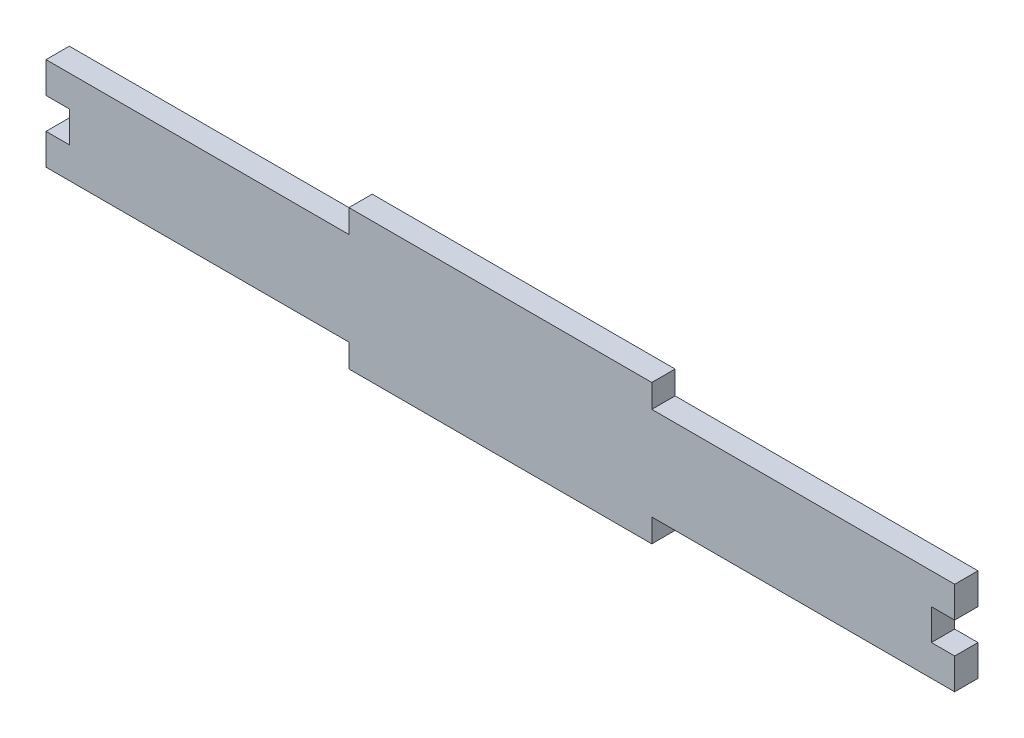
ISO-10303-21;
HEADER;
FILE_DESCRIPTION(('STEP AP214'),'2;1');
FILE_NAME('part.step','',(''),(''),'','','');
FILE_SCHEMA(('AUTOMOTIVE_DESIGN { 1 0 10303 214 1 1 1 1 }'));
ENDSEC;
DATA;
#1=APPLICATION_CONTEXT('core data for automotive mechanical design processes');
#2=APPLICATION_PROTOCOL_DEFINITION('international standard','automotive_design',2000,#1);
#3=PRODUCT_CONTEXT('',#1,'mechanical');
#4=PRODUCT('Part','Part','',(#3));
#5=PRODUCT_RELATED_PRODUCT_CATEGORY('part','',(#4));
#6=PRODUCT_DEFINITION_FORMATION('','',#4);
#7=PRODUCT_DEFINITION_CONTEXT('part definition',#1,'design');
#8=PRODUCT_DEFINITION('design','',#6,#7);
#9=PRODUCT_DEFINITION_SHAPE('','',#8);
#10=(LENGTH_UNIT() NAMED_UNIT(*) SI_UNIT(.MILLI.,.METRE.));
#11=(NAMED_UNIT(*) PLANE_ANGLE_UNIT() SI_UNIT($,.RADIAN.));
#12=(NAMED_UNIT(*) SI_UNIT($,.STERADIAN.) SOLID_ANGLE_UNIT());
#13=UNCERTAINTY_MEASURE_WITH_UNIT(LENGTH_MEASURE(1.E-05),#10,'distance_accuracy_value','');
#14=(GEOMETRIC_REPRESENTATION_CONTEXT(3) GLOBAL_UNCERTAINTY_ASSIGNED_CONTEXT((#13)) GLOBAL_UNIT_ASSIGNED_CONTEXT((#10,
#11,#12)) REPRESENTATION_CONTEXT('',''));
#15=CARTESIAN_POINT('',(0.,0.,0.));
#16=DIRECTION('',(0.,0.,1.));
#17=DIRECTION('',(1.,0.,0.));
#18=AXIS2_PLACEMENT_3D('',#15,#16,#17);
#19=CARTESIAN_POINT('',(-19.5,-8.99999999999999,3.));
#20=DIRECTION('',(1.,0.,0.));
#21=DIRECTION('',(0.,0.,-1.));
#22=AXIS2_PLACEMENT_3D('',#19,#20,#21);
#23=PLANE('',#22);
#24=DIRECTION('',(0.,-1.,0.));
#25=VECTOR('',#24,1.);
#26=CARTESIAN_POINT('',(-19.5,-8.99999999999999,0.));
#27=LINE('',#26,#25);
#28=CARTESIAN_POINT('',(-19.5,-6.00000000000001,0.));
#29=VERTEX_POINT('',#28);
#30=CARTESIAN_POINT('',(-19.5,-8.99999999999999,0.));
#31=VERTEX_POINT('',#30);
#32=EDGE_CURVE('E201',#29,#31,#27,.T.);
#33=ORIENTED_EDGE('',*,*,#32,.T.);
#34=DIRECTION('',(0.,0.,-1.));
#35=VECTOR('',#34,1.);
#36=CARTESIAN_POINT('',(-19.5,-8.99999999999999,3.));
#37=LINE('',#36,#35);
#38=CARTESIAN_POINT('',(-19.5,-8.99999999999999,3.));
#39=VERTEX_POINT('',#38);
#40=EDGE_CURVE('E11',#39,#31,#37,.T.);
#41=ORIENTED_EDGE('',*,*,#40,.F.);
#42=DIRECTION('',(0.,-1.,0.));
#43=VECTOR('',#42,1.);
#44=CARTESIAN_POINT('',(-19.5,-8.99999999999999,3.));
#45=LINE('',#44,#43);
#46=CARTESIAN_POINT('',(-19.5,-6.00000000000001,3.));
#47=VERTEX_POINT('',#46);
#48=EDGE_CURVE('E239',#47,#39,#45,.T.);
#49=ORIENTED_EDGE('',*,*,#48,.F.);
#50=DIRECTION('',(0.,0.,-1.));
#51=VECTOR('',#50,1.);
#52=CARTESIAN_POINT('',(-19.5,-6.00000000000001,3.));
#53=LINE('',#52,#51);
#54=EDGE_CURVE('E197',#47,#29,#53,.T.);
#55=ORIENTED_EDGE('',*,*,#54,.T.);
#56=EDGE_LOOP('',(#33,#41,#49,#55));
#57=FACE_BOUND('',#56,.T.);
#58=ADVANCED_FACE('F33',(#57),#23,.F.);
#59=CARTESIAN_POINT('',(-19.5,-8.99999999999999,3.));
#60=DIRECTION('',(0.,1.,0.));
#61=DIRECTION('',(-1.,0.,0.));
#62=AXIS2_PLACEMENT_3D('',#59,#60,#61);
#63=PLANE('',#62);
#64=DIRECTION('',(1.,0.,0.));
#65=VECTOR('',#64,1.);
#66=CARTESIAN_POINT('',(-19.5,-8.99999999999999,0.));
#67=LINE('',#66,#65);
#68=CARTESIAN_POINT('',(19.5,-9.,0.));
#69=VERTEX_POINT('',#68);
#70=EDGE_CURVE('E204',#31,#69,#67,.T.);
#71=ORIENTED_EDGE('',*,*,#70,.T.);
#72=DIRECTION('',(0.,0.,-1.));
#73=VECTOR('',#72,1.);
#74=CARTESIAN_POINT('',(19.5,-9.,3.));
#75=LINE('',#74,#73);
#76=CARTESIAN_POINT('',(19.5,-9.,3.));
#77=VERTEX_POINT('',#76);
#78=EDGE_CURVE('E41',#77,#69,#75,.T.);
#79=ORIENTED_EDGE('',*,*,#78,.F.);
#80=DIRECTION('',(1.,0.,0.));
#81=VECTOR('',#80,1.);
#82=CARTESIAN_POINT('',(-19.5,-8.99999999999999,3.));
#83=LINE('',#82,#81);
#84=EDGE_CURVE('E128',#39,#77,#83,.T.);
#85=ORIENTED_EDGE('',*,*,#84,.F.);
#86=ORIENTED_EDGE('',*,*,#40,.T.);
#87=EDGE_LOOP('',(#71,#79,#85,#86));
#88=FACE_BOUND('',#87,.T.);
#89=ADVANCED_FACE('F357',(#88),#63,.F.);
#90=CARTESIAN_POINT('',(19.5,-6.00000000000002,3.));
#91=DIRECTION('',(-1.,0.,0.));
#92=DIRECTION('',(0.,0.,1.));
#93=AXIS2_PLACEMENT_3D('',#90,#91,#92);
#94=PLANE('',#93);
#95=DIRECTION('',(0.,1.,0.));
#96=VECTOR('',#95,1.);
#97=CARTESIAN_POINT('',(19.5,-6.00000000000002,0.));
#98=LINE('',#97,#96);
#99=CARTESIAN_POINT('',(19.5,-6.00000000000002,0.));
#100=VERTEX_POINT('',#99);
#101=EDGE_CURVE('E206',#69,#100,#98,.T.);
#102=ORIENTED_EDGE('',*,*,#101,.T.);
#103=DIRECTION('',(0.,0.,-1.));
#104=VECTOR('',#103,1.);
#105=CARTESIAN_POINT('',(19.5,-6.00000000000002,3.));
#106=LINE('',#105,#104);
#107=CARTESIAN_POINT('',(19.5,-6.00000000000002,3.));
#108=VERTEX_POINT('',#107);
#109=EDGE_CURVE('E282',#108,#100,#106,.T.);
#110=ORIENTED_EDGE('',*,*,#109,.F.);
#111=DIRECTION('',(0.,1.,0.));
#112=VECTOR('',#111,1.);
#113=CARTESIAN_POINT('',(19.5,-6.00000000000002,3.));
#114=LINE('',#113,#112);
#115=EDGE_CURVE('E290',#77,#108,#114,.T.);
#116=ORIENTED_EDGE('',*,*,#115,.F.);
#117=ORIENTED_EDGE('',*,*,#78,.T.);
#118=EDGE_LOOP('',(#102,#110,#116,#117));
#119=FACE_BOUND('',#118,.T.);
#120=ADVANCED_FACE('F288',(#119),#94,.F.);
#121=CARTESIAN_POINT('',(58.5,-6.00000000000002,3.));
#122=DIRECTION('',(0.,1.,0.));
#123=DIRECTION('',(-1.,0.,0.));
#124=AXIS2_PLACEMENT_3D('',#121,#122,#123);
#125=PLANE('',#124);
#126=DIRECTION('',(1.,0.,0.));
#127=VECTOR('',#126,1.);
#128=CARTESIAN_POINT('',(58.5,-6.00000000000002,0.));
#129=LINE('',#128,#127);
#130=CARTESIAN_POINT('',(58.5,-6.00000000000002,0.));
#131=VERTEX_POINT('',#130);
#132=EDGE_CURVE('E208',#100,#131,#129,.T.);
#133=ORIENTED_EDGE('',*,*,#132,.T.);
#134=DIRECTION('',(0.,0.,-1.));
#135=VECTOR('',#134,1.);
#136=CARTESIAN_POINT('',(58.5,-6.00000000000002,3.));
#137=LINE('',#136,#135);
#138=CARTESIAN_POINT('',(58.5,-6.00000000000002,3.));
#139=VERTEX_POINT('',#138);
#140=EDGE_CURVE('E279',#139,#131,#137,.T.);
#141=ORIENTED_EDGE('',*,*,#140,.F.);
#142=DIRECTION('',(1.,0.,0.));
#143=VECTOR('',#142,1.);
#144=CARTESIAN_POINT('',(58.5,-6.00000000000002,3.));
#145=LINE('',#144,#143);
#146=EDGE_CURVE('E308',#108,#139,#145,.T.);
#147=ORIENTED_EDGE('',*,*,#146,.F.);
#148=ORIENTED_EDGE('',*,*,#109,.T.);
#149=EDGE_LOOP('',(#133,#141,#147,#148));
#150=FACE_BOUND('',#149,.T.);
#151=ADVANCED_FACE('F299',(#150),#125,.F.);
#152=CARTESIAN_POINT('',(58.5,-2.00000000000001,3.));
#153=DIRECTION('',(-1.,0.,0.));
#154=DIRECTION('',(0.,0.,1.));
#155=AXIS2_PLACEMENT_3D('',#152,#153,#154);
#156=PLANE('',#155);
#157=DIRECTION('',(0.,1.,0.));
#158=VECTOR('',#157,1.);
#159=CARTESIAN_POINT('',(58.5,-2.00000000000001,0.));
#160=LINE('',#159,#158);
#161=CARTESIAN_POINT('',(58.5,-2.00000000000001,0.));
#162=VERTEX_POINT('',#161);
#163=EDGE_CURVE('E210',#131,#162,#160,.T.);
#164=ORIENTED_EDGE('',*,*,#163,.T.);
#165=DIRECTION('',(0.,0.,-1.));
#166=VECTOR('',#165,1.);
#167=CARTESIAN_POINT('',(58.5,-2.00000000000001,3.));
#168=LINE('',#167,#166);
#169=CARTESIAN_POINT('',(58.5,-2.00000000000001,3.));
#170=VERTEX_POINT('',#169);
#171=EDGE_CURVE('E276',#170,#162,#168,.T.);
#172=ORIENTED_EDGE('',*,*,#171,.F.);
#173=DIRECTION('',(0.,1.,0.));
#174=VECTOR('',#173,1.);
#175=CARTESIAN_POINT('',(58.5,-2.00000000000001,3.));
#176=LINE('',#175,#174);
#177=EDGE_CURVE('E305',#139,#170,#176,.T.);
#178=ORIENTED_EDGE('',*,*,#177,.F.);
#179=ORIENTED_EDGE('',*,*,#140,.T.);
#180=EDGE_LOOP('',(#164,#172,#178,#179));
#181=FACE_BOUND('',#180,.T.);
#182=ADVANCED_FACE('F303',(#181),#156,.F.);
#183=CARTESIAN_POINT('',(58.5,-2.00000000000001,3.));
#184=DIRECTION('',(0.,-1.,0.));
#185=DIRECTION('',(0.,0.,-1.));
#186=AXIS2_PLACEMENT_3D('',#183,#184,#185);
#187=PLANE('',#186);
#188=DIRECTION('',(-1.,0.,0.));
#189=VECTOR('',#188,1.);
#190=CARTESIAN_POINT('',(58.5,-2.00000000000001,0.));
#191=LINE('',#190,#189);
#192=CARTESIAN_POINT('',(55.5,-2.00000000000001,0.));
#193=VERTEX_POINT('',#192);
#194=EDGE_CURVE('E212',#162,#193,#191,.T.);
#195=ORIENTED_EDGE('',*,*,#194,.T.);
#196=DIRECTION('',(0.,0.,-1.));
#197=VECTOR('',#196,1.);
#198=CARTESIAN_POINT('',(55.5,-2.00000000000001,3.));
#199=LINE('',#198,#197);
#200=CARTESIAN_POINT('',(55.5,-2.00000000000001,3.));
#201=VERTEX_POINT('',#200);
#202=EDGE_CURVE('E273',#201,#193,#199,.T.);
#203=ORIENTED_EDGE('',*,*,#202,.F.);
#204=DIRECTION('',(-1.,0.,0.));
#205=VECTOR('',#204,1.);
#206=CARTESIAN_POINT('',(58.5,-2.00000000000001,3.));
#207=LINE('',#206,#205);
#208=EDGE_CURVE('E307',#170,#201,#207,.T.);
#209=ORIENTED_EDGE('',*,*,#208,.F.);
#210=ORIENTED_EDGE('',*,*,#171,.T.);
#211=EDGE_LOOP('',(#195,#203,#209,#210));
#212=FACE_BOUND('',#211,.T.);
#213=ADVANCED_FACE('F370',(#212),#187,.F.);
#214=CARTESIAN_POINT('',(55.5,-2.00000000000001,3.));
#215=DIRECTION('',(-1.,0.,0.));
#216=DIRECTION('',(0.,-1.,0.));
#217=AXIS2_PLACEMENT_3D('',#214,#215,#216);
#218=PLANE('',#217);
#219=DIRECTION('',(0.,1.,0.));
#220=VECTOR('',#219,1.);
#221=CARTESIAN_POINT('',(55.5,-2.00000000000001,0.));
#222=LINE('',#221,#220);
#223=CARTESIAN_POINT('',(55.5,2.00000000000001,0.));
#224=VERTEX_POINT('',#223);
#225=EDGE_CURVE('E214',#193,#224,#222,.T.);
#226=ORIENTED_EDGE('',*,*,#225,.T.);
#227=DIRECTION('',(0.,0.,-1.));
#228=VECTOR('',#227,1.);
#229=CARTESIAN_POINT('',(55.5,2.00000000000001,3.));
#230=LINE('',#229,#228);
#231=CARTESIAN_POINT('',(55.5,2.00000000000001,3.));
#232=VERTEX_POINT('',#231);
#233=EDGE_CURVE('E270',#232,#224,#230,.T.);
#234=ORIENTED_EDGE('',*,*,#233,.F.);
#235=DIRECTION('',(0.,1.,0.));
#236=VECTOR('',#235,1.);
#237=CARTESIAN_POINT('',(55.5,-2.00000000000001,3.));
#238=LINE('',#237,#236);
#239=EDGE_CURVE('E310',#201,#232,#238,.T.);
#240=ORIENTED_EDGE('',*,*,#239,.F.);
#241=ORIENTED_EDGE('',*,*,#202,.T.);
#242=EDGE_LOOP('',(#226,#234,#240,#241));
#243=FACE_BOUND('',#242,.T.);
#244=ADVANCED_FACE('F373',(#243),#218,.F.);
#245=CARTESIAN_POINT('',(55.5,2.00000000000001,3.));
#246=DIRECTION('',(0.,1.,0.));
#247=DIRECTION('',(0.,0.,1.));
#248=AXIS2_PLACEMENT_3D('',#245,#246,#247);
#249=PLANE('',#248);
#250=DIRECTION('',(1.,0.,0.));
#251=VECTOR('',#250,1.);
#252=CARTESIAN_POINT('',(55.5,2.00000000000001,0.));
#253=LINE('',#252,#251);
#254=CARTESIAN_POINT('',(58.5,2.00000000000001,0.));
#255=VERTEX_POINT('',#254);
#256=EDGE_CURVE('E216',#224,#255,#253,.T.);
#257=ORIENTED_EDGE('',*,*,#256,.T.);
#258=DIRECTION('',(0.,0.,-1.));
#259=VECTOR('',#258,1.);
#260=CARTESIAN_POINT('',(58.5,2.00000000000001,3.));
#261=LINE('',#260,#259);
#262=CARTESIAN_POINT('',(58.5,2.00000000000001,3.));
#263=VERTEX_POINT('',#262);
#264=EDGE_CURVE('E267',#263,#255,#261,.T.);
#265=ORIENTED_EDGE('',*,*,#264,.F.);
#266=DIRECTION('',(1.,0.,0.));
#267=VECTOR('',#266,1.);
#268=CARTESIAN_POINT('',(55.5,2.00000000000001,3.));
#269=LINE('',#268,#267);
#270=EDGE_CURVE('E316',#232,#263,#269,.T.);
#271=ORIENTED_EDGE('',*,*,#270,.F.);
#272=ORIENTED_EDGE('',*,*,#233,.T.);
#273=EDGE_LOOP('',(#257,#265,#271,#272));
#274=FACE_BOUND('',#273,.T.);
#275=ADVANCED_FACE('F377',(#274),#249,.F.);
#276=CARTESIAN_POINT('',(58.5,6.00000000000002,3.));
#277=DIRECTION('',(-1.,0.,0.));
#278=DIRECTION('',(0.,-1.,0.));
#279=AXIS2_PLACEMENT_3D('',#276,#277,#278);
#280=PLANE('',#279);
#281=DIRECTION('',(0.,1.,0.));
#282=VECTOR('',#281,1.);
#283=CARTESIAN_POINT('',(58.5,6.00000000000002,0.));
#284=LINE('',#283,#282);
#285=CARTESIAN_POINT('',(58.5,6.00000000000002,0.));
#286=VERTEX_POINT('',#285);
#287=EDGE_CURVE('E218',#255,#286,#284,.T.);
#288=ORIENTED_EDGE('',*,*,#287,.T.);
#289=DIRECTION('',(0.,0.,-1.));
#290=VECTOR('',#289,1.);
#291=CARTESIAN_POINT('',(58.5,6.00000000000002,3.));
#292=LINE('',#291,#290);
#293=CARTESIAN_POINT('',(58.5,6.00000000000002,3.));
#294=VERTEX_POINT('',#293);
#295=EDGE_CURVE('E264',#294,#286,#292,.T.);
#296=ORIENTED_EDGE('',*,*,#295,.F.);
#297=DIRECTION('',(0.,1.,0.));
#298=VECTOR('',#297,1.);
#299=CARTESIAN_POINT('',(58.5,6.00000000000002,3.));
#300=LINE('',#299,#298);
#301=EDGE_CURVE('E318',#263,#294,#300,.T.);
#302=ORIENTED_EDGE('',*,*,#301,.F.);
#303=ORIENTED_EDGE('',*,*,#264,.T.);
#304=EDGE_LOOP('',(#288,#296,#302,#303));
#305=FACE_BOUND('',#304,.T.);
#306=ADVANCED_FACE('F381',(#305),#280,.F.);
#307=CARTESIAN_POINT('',(19.5,6.00000000000002,3.));
#308=DIRECTION('',(0.,-1.,0.));
#309=DIRECTION('',(0.,0.,-1.));
#310=AXIS2_PLACEMENT_3D('',#307,#308,#309);
#311=PLANE('',#310);
#312=DIRECTION('',(-1.,0.,0.));
#313=VECTOR('',#312,1.);
#314=CARTESIAN_POINT('',(19.5,6.00000000000002,0.));
#315=LINE('',#314,#313);
#316=CARTESIAN_POINT('',(19.5,6.00000000000002,0.));
#317=VERTEX_POINT('',#316);
#318=EDGE_CURVE('E220',#286,#317,#315,.T.);
#319=ORIENTED_EDGE('',*,*,#318,.T.);
#320=DIRECTION('',(0.,0.,-1.));
#321=VECTOR('',#320,1.);
#322=CARTESIAN_POINT('',(19.5,6.00000000000002,3.));
#323=LINE('',#322,#321);
#324=CARTESIAN_POINT('',(19.5,6.00000000000002,3.));
#325=VERTEX_POINT('',#324);
#326=EDGE_CURVE('E261',#325,#317,#323,.T.);
#327=ORIENTED_EDGE('',*,*,#326,.F.);
#328=DIRECTION('',(-1.,0.,0.));
#329=VECTOR('',#328,1.);
#330=CARTESIAN_POINT('',(19.5,6.00000000000002,3.));
#331=LINE('',#330,#329);
#332=EDGE_CURVE('E320',#294,#325,#331,.T.);
#333=ORIENTED_EDGE('',*,*,#332,.F.);
#334=ORIENTED_EDGE('',*,*,#295,.T.);
#335=EDGE_LOOP('',(#319,#327,#333,#334));
#336=FACE_BOUND('',#335,.T.);
#337=ADVANCED_FACE('F385',(#336),#311,.F.);
#338=CARTESIAN_POINT('',(19.5,8.99999999999999,3.));
#339=DIRECTION('',(-1.,0.,0.));
#340=DIRECTION('',(0.,0.,1.));
#341=AXIS2_PLACEMENT_3D('',#338,#339,#340);
#342=PLANE('',#341);
#343=DIRECTION('',(0.,1.,0.));
#344=VECTOR('',#343,1.);
#345=CARTESIAN_POINT('',(19.5,8.99999999999999,0.));
#346=LINE('',#345,#344);
#347=CARTESIAN_POINT('',(19.5,8.99999999999999,0.));
#348=VERTEX_POINT('',#347);
#349=EDGE_CURVE('E222',#317,#348,#346,.T.);
#350=ORIENTED_EDGE('',*,*,#349,.T.);
#351=DIRECTION('',(0.,0.,-1.));
#352=VECTOR('',#351,1.);
#353=CARTESIAN_POINT('',(19.5,8.99999999999999,3.));
#354=LINE('',#353,#352);
#355=CARTESIAN_POINT('',(19.5,8.99999999999999,3.));
#356=VERTEX_POINT('',#355);
#357=EDGE_CURVE('E258',#356,#348,#354,.T.);
#358=ORIENTED_EDGE('',*,*,#357,.F.);
#359=DIRECTION('',(0.,1.,0.));
#360=VECTOR('',#359,1.);
#361=CARTESIAN_POINT('',(19.5,8.99999999999999,3.));
#362=LINE('',#361,#360);
#363=EDGE_CURVE('E322',#325,#356,#362,.T.);
#364=ORIENTED_EDGE('',*,*,#363,.F.);
#365=ORIENTED_EDGE('',*,*,#326,.T.);
#366=EDGE_LOOP('',(#350,#358,#364,#365));
#367=FACE_BOUND('',#366,.T.);
#368=ADVANCED_FACE('F389',(#367),#342,.F.);
#369=CARTESIAN_POINT('',(19.5,8.99999999999999,3.));
#370=DIRECTION('',(0.,-1.,0.));
#371=DIRECTION('',(1.,0.,0.));
#372=AXIS2_PLACEMENT_3D('',#369,#370,#371);
#373=PLANE('',#372);
#374=DIRECTION('',(-1.,0.,0.));
#375=VECTOR('',#374,1.);
#376=CARTESIAN_POINT('',(19.5,8.99999999999999,0.));
#377=LINE('',#376,#375);
#378=CARTESIAN_POINT('',(-19.5,9.,0.));
#379=VERTEX_POINT('',#378);
#380=EDGE_CURVE('E224',#348,#379,#377,.T.);
#381=ORIENTED_EDGE('',*,*,#380,.T.);
#382=DIRECTION('',(0.,0.,-1.));
#383=VECTOR('',#382,1.);
#384=CARTESIAN_POINT('',(-19.5,9.,3.));
#385=LINE('',#384,#383);
#386=CARTESIAN_POINT('',(-19.5,9.,3.));
#387=VERTEX_POINT('',#386);
#388=EDGE_CURVE('E255',#387,#379,#385,.T.);
#389=ORIENTED_EDGE('',*,*,#388,.F.);
#390=DIRECTION('',(-1.,0.,0.));
#391=VECTOR('',#390,1.);
#392=CARTESIAN_POINT('',(19.5,8.99999999999999,3.));
#393=LINE('',#392,#391);
#394=EDGE_CURVE('E324',#356,#387,#393,.T.);
#395=ORIENTED_EDGE('',*,*,#394,.F.);
#396=ORIENTED_EDGE('',*,*,#357,.T.);
#397=EDGE_LOOP('',(#381,#389,#395,#396));
#398=FACE_BOUND('',#397,.T.);
#399=ADVANCED_FACE('F393',(#398),#373,.F.);
#400=CARTESIAN_POINT('',(-19.5,9.,3.));
#401=DIRECTION('',(1.,0.,0.));
#402=DIRECTION('',(0.,0.,-1.));
#403=AXIS2_PLACEMENT_3D('',#400,#401,#402);
#404=PLANE('',#403);
#405=DIRECTION('',(0.,-1.,0.));
#406=VECTOR('',#405,1.);
#407=CARTESIAN_POINT('',(-19.5,9.,0.));
#408=LINE('',#407,#406);
#409=CARTESIAN_POINT('',(-19.5,6.00000000000002,0.));
#410=VERTEX_POINT('',#409);
#411=EDGE_CURVE('E226',#379,#410,#408,.T.);
#412=ORIENTED_EDGE('',*,*,#411,.T.);
#413=DIRECTION('',(0.,0.,-1.));
#414=VECTOR('',#413,1.);
#415=CARTESIAN_POINT('',(-19.5,6.00000000000002,3.));
#416=LINE('',#415,#414);
#417=CARTESIAN_POINT('',(-19.5,6.00000000000002,3.));
#418=VERTEX_POINT('',#417);
#419=EDGE_CURVE('E252',#418,#410,#416,.T.);
#420=ORIENTED_EDGE('',*,*,#419,.F.);
#421=DIRECTION('',(0.,-1.,0.));
#422=VECTOR('',#421,1.);
#423=CARTESIAN_POINT('',(-19.5,9.,3.));
#424=LINE('',#423,#422);
#425=EDGE_CURVE('E326',#387,#418,#424,.T.);
#426=ORIENTED_EDGE('',*,*,#425,.F.);
#427=ORIENTED_EDGE('',*,*,#388,.T.);
#428=EDGE_LOOP('',(#412,#420,#426,#427));
#429=FACE_BOUND('',#428,.T.);
#430=ADVANCED_FACE('F397',(#429),#404,.F.);
#431=CARTESIAN_POINT('',(-19.5,6.00000000000002,3.));
#432=DIRECTION('',(0.,-1.,0.));
#433=DIRECTION('',(0.,0.,-1.));
#434=AXIS2_PLACEMENT_3D('',#431,#432,#433);
#435=PLANE('',#434);
#436=DIRECTION('',(-1.,0.,0.));
#437=VECTOR('',#436,1.);
#438=CARTESIAN_POINT('',(-19.5,6.00000000000002,0.));
#439=LINE('',#438,#437);
#440=CARTESIAN_POINT('',(-58.5,6.00000000000002,0.));
#441=VERTEX_POINT('',#440);
#442=EDGE_CURVE('E228',#410,#441,#439,.T.);
#443=ORIENTED_EDGE('',*,*,#442,.T.);
#444=DIRECTION('',(0.,0.,-1.));
#445=VECTOR('',#444,1.);
#446=CARTESIAN_POINT('',(-58.5,6.00000000000002,3.));
#447=LINE('',#446,#445);
#448=CARTESIAN_POINT('',(-58.5,6.00000000000002,3.));
#449=VERTEX_POINT('',#448);
#450=EDGE_CURVE('E249',#449,#441,#447,.T.);
#451=ORIENTED_EDGE('',*,*,#450,.F.);
#452=DIRECTION('',(-1.,0.,0.));
#453=VECTOR('',#452,1.);
#454=CARTESIAN_POINT('',(-19.5,6.00000000000002,3.));
#455=LINE('',#454,#453);
#456=EDGE_CURVE('E328',#418,#449,#455,.T.);
#457=ORIENTED_EDGE('',*,*,#456,.F.);
#458=ORIENTED_EDGE('',*,*,#419,.T.);
#459=EDGE_LOOP('',(#443,#451,#457,#458));
#460=FACE_BOUND('',#459,.T.);
#461=ADVANCED_FACE('F401',(#460),#435,.F.);
#462=CARTESIAN_POINT('',(-58.5,6.00000000000002,3.));
#463=DIRECTION('',(1.,0.,0.));
#464=DIRECTION('',(0.,1.,0.));
#465=AXIS2_PLACEMENT_3D('',#462,#463,#464);
#466=PLANE('',#465);
#467=DIRECTION('',(0.,-1.,0.));
#468=VECTOR('',#467,1.);
#469=CARTESIAN_POINT('',(-58.5,6.00000000000002,0.));
#470=LINE('',#469,#468);
#471=CARTESIAN_POINT('',(-58.5,2.00000000000001,0.));
#472=VERTEX_POINT('',#471);
#473=EDGE_CURVE('E230',#441,#472,#470,.T.);
#474=ORIENTED_EDGE('',*,*,#473,.T.);
#475=DIRECTION('',(0.,0.,-1.));
#476=VECTOR('',#475,1.);
#477=CARTESIAN_POINT('',(-58.5,2.00000000000001,3.));
#478=LINE('',#477,#476);
#479=CARTESIAN_POINT('',(-58.5,2.00000000000001,3.));
#480=VERTEX_POINT('',#479);
#481=EDGE_CURVE('E246',#480,#472,#478,.T.);
#482=ORIENTED_EDGE('',*,*,#481,.F.);
#483=DIRECTION('',(0.,-1.,0.));
#484=VECTOR('',#483,1.);
#485=CARTESIAN_POINT('',(-58.5,6.00000000000002,3.));
#486=LINE('',#485,#484);
#487=EDGE_CURVE('E330',#449,#480,#486,.T.);
#488=ORIENTED_EDGE('',*,*,#487,.F.);
#489=ORIENTED_EDGE('',*,*,#450,.T.);
#490=EDGE_LOOP('',(#474,#482,#488,#489));
#491=FACE_BOUND('',#490,.T.);
#492=ADVANCED_FACE('F405',(#491),#466,.F.);
#493=CARTESIAN_POINT('',(-58.5,2.00000000000001,3.));
#494=DIRECTION('',(0.,1.,0.));
#495=DIRECTION('',(0.,0.,1.));
#496=AXIS2_PLACEMENT_3D('',#493,#494,#495);
#497=PLANE('',#496);
#498=DIRECTION('',(1.,0.,0.));
#499=VECTOR('',#498,1.);
#500=CARTESIAN_POINT('',(-58.5,2.00000000000001,0.));
#501=LINE('',#500,#499);
#502=CARTESIAN_POINT('',(-55.5,2.00000000000001,0.));
#503=VERTEX_POINT('',#502);
#504=EDGE_CURVE('E232',#472,#503,#501,.T.);
#505=ORIENTED_EDGE('',*,*,#504,.T.);
#506=DIRECTION('',(0.,0.,-1.));
#507=VECTOR('',#506,1.);
#508=CARTESIAN_POINT('',(-55.5,2.00000000000001,3.));
#509=LINE('',#508,#507);
#510=CARTESIAN_POINT('',(-55.5,2.00000000000001,3.));
#511=VERTEX_POINT('',#510);
#512=EDGE_CURVE('E243',#511,#503,#509,.T.);
#513=ORIENTED_EDGE('',*,*,#512,.F.);
#514=DIRECTION('',(1.,0.,0.));
#515=VECTOR('',#514,1.);
#516=CARTESIAN_POINT('',(-58.5,2.00000000000001,3.));
#517=LINE('',#516,#515);
#518=EDGE_CURVE('E332',#480,#511,#517,.T.);
#519=ORIENTED_EDGE('',*,*,#518,.F.);
#520=ORIENTED_EDGE('',*,*,#481,.T.);
#521=EDGE_LOOP('',(#505,#513,#519,#520));
#522=FACE_BOUND('',#521,.T.);
#523=ADVANCED_FACE('F338',(#522),#497,.F.);
#524=CARTESIAN_POINT('',(-55.5,2.00000000000001,3.));
#525=DIRECTION('',(1.,0.,0.));
#526=DIRECTION('',(0.,1.,0.));
#527=AXIS2_PLACEMENT_3D('',#524,#525,#526);
#528=PLANE('',#527);
#529=DIRECTION('',(0.,-1.,0.));
#530=VECTOR('',#529,1.);
#531=CARTESIAN_POINT('',(-55.5,2.00000000000001,0.));
#532=LINE('',#531,#530);
#533=CARTESIAN_POINT('',(-55.5,-2.00000000000001,0.));
#534=VERTEX_POINT('',#533);
#535=EDGE_CURVE('E234',#503,#534,#532,.T.);
#536=ORIENTED_EDGE('',*,*,#535,.T.);
#537=DIRECTION('',(0.,0.,-1.));
#538=VECTOR('',#537,1.);
#539=CARTESIAN_POINT('',(-55.5,-2.00000000000001,3.));
#540=LINE('',#539,#538);
#541=CARTESIAN_POINT('',(-55.5,-2.00000000000001,3.));
#542=VERTEX_POINT('',#541);
#543=EDGE_CURVE('E192',#542,#534,#540,.T.);
#544=ORIENTED_EDGE('',*,*,#543,.F.);
#545=DIRECTION('',(0.,-1.,0.));
#546=VECTOR('',#545,1.);
#547=CARTESIAN_POINT('',(-55.5,2.00000000000001,3.));
#548=LINE('',#547,#546);
#549=EDGE_CURVE('E183',#511,#542,#548,.T.);
#550=ORIENTED_EDGE('',*,*,#549,.F.);
#551=ORIENTED_EDGE('',*,*,#512,.T.);
#552=EDGE_LOOP('',(#536,#544,#550,#551));
#553=FACE_BOUND('',#552,.T.);
#554=ADVANCED_FACE('F342',(#553),#528,.F.);
#555=CARTESIAN_POINT('',(-55.5,-2.00000000000001,3.));
#556=DIRECTION('',(0.,-1.,0.));
#557=DIRECTION('',(1.,0.,0.));
#558=AXIS2_PLACEMENT_3D('',#555,#556,#557);
#559=PLANE('',#558);
#560=DIRECTION('',(-1.,0.,0.));
#561=VECTOR('',#560,1.);
#562=CARTESIAN_POINT('',(-55.5,-2.00000000000001,0.));
#563=LINE('',#562,#561);
#564=CARTESIAN_POINT('',(-58.5,-2.00000000000001,0.));
#565=VERTEX_POINT('',#564);
#566=EDGE_CURVE('E191',#534,#565,#563,.T.);
#567=ORIENTED_EDGE('',*,*,#566,.T.);
#568=DIRECTION('',(0.,0.,-1.));
#569=VECTOR('',#568,1.);
#570=CARTESIAN_POINT('',(-58.5,-2.00000000000001,3.));
#571=LINE('',#570,#569);
#572=CARTESIAN_POINT('',(-58.5,-2.00000000000001,3.));
#573=VERTEX_POINT('',#572);
#574=EDGE_CURVE('E188',#573,#565,#571,.T.);
#575=ORIENTED_EDGE('',*,*,#574,.F.);
#576=DIRECTION('',(-1.,0.,0.));
#577=VECTOR('',#576,1.);
#578=CARTESIAN_POINT('',(-55.5,-2.00000000000001,3.));
#579=LINE('',#578,#577);
#580=EDGE_CURVE('E177',#542,#573,#579,.T.);
#581=ORIENTED_EDGE('',*,*,#580,.F.);
#582=ORIENTED_EDGE('',*,*,#543,.T.);
#583=EDGE_LOOP('',(#567,#575,#581,#582));
#584=FACE_BOUND('',#583,.T.);
#585=ADVANCED_FACE('F189',(#584),#559,.F.);
#586=CARTESIAN_POINT('',(-58.5,-2.00000000000001,3.));
#587=DIRECTION('',(1.,0.,0.));
#588=DIRECTION('',(0.,0.,-1.));
#589=AXIS2_PLACEMENT_3D('',#586,#587,#588);
#590=PLANE('',#589);
#591=DIRECTION('',(0.,-1.,0.));
#592=VECTOR('',#591,1.);
#593=CARTESIAN_POINT('',(-58.5,-2.00000000000001,0.));
#594=LINE('',#593,#592);
#595=CARTESIAN_POINT('',(-58.5,-6.00000000000002,0.));
#596=VERTEX_POINT('',#595);
#597=EDGE_CURVE('E114',#565,#596,#594,.T.);
#598=ORIENTED_EDGE('',*,*,#597,.T.);
#599=DIRECTION('',(0.,0.,-1.));
#600=VECTOR('',#599,1.);
#601=CARTESIAN_POINT('',(-58.5,-6.00000000000002,3.));
#602=LINE('',#601,#600);
#603=CARTESIAN_POINT('',(-58.5,-6.00000000000002,3.));
#604=VERTEX_POINT('',#603);
#605=EDGE_CURVE('E193',#604,#596,#602,.T.);
#606=ORIENTED_EDGE('',*,*,#605,.F.);
#607=DIRECTION('',(0.,-1.,0.));
#608=VECTOR('',#607,1.);
#609=CARTESIAN_POINT('',(-58.5,-2.00000000000001,3.));
#610=LINE('',#609,#608);
#611=EDGE_CURVE('E181',#573,#604,#610,.T.);
#612=ORIENTED_EDGE('',*,*,#611,.F.);
#613=ORIENTED_EDGE('',*,*,#574,.T.);
#614=EDGE_LOOP('',(#598,#606,#612,#613));
#615=FACE_BOUND('',#614,.T.);
#616=ADVANCED_FACE('F195',(#615),#590,.F.);
#617=CARTESIAN_POINT('',(-19.5,-6.00000000000001,3.));
#618=DIRECTION('',(0.,1.,0.));
#619=DIRECTION('',(-1.,0.,0.));
#620=AXIS2_PLACEMENT_3D('',#617,#618,#619);
#621=PLANE('',#620);
#622=DIRECTION('',(1.,0.,0.));
#623=VECTOR('',#622,1.);
#624=CARTESIAN_POINT('',(-19.5,-6.00000000000001,0.));
#625=LINE('',#624,#623);
#626=EDGE_CURVE('E120',#596,#29,#625,.T.);
#627=ORIENTED_EDGE('',*,*,#626,.T.);
#628=ORIENTED_EDGE('',*,*,#54,.F.);
#629=DIRECTION('',(1.,0.,0.));
#630=VECTOR('',#629,1.);
#631=CARTESIAN_POINT('',(-19.5,-6.00000000000001,3.));
#632=LINE('',#631,#630);
#633=EDGE_CURVE('E49',#604,#47,#632,.T.);
#634=ORIENTED_EDGE('',*,*,#633,.F.);
#635=ORIENTED_EDGE('',*,*,#605,.T.);
#636=EDGE_LOOP('',(#627,#628,#634,#635));
#637=FACE_BOUND('',#636,.T.);
#638=ADVANCED_FACE('F346',(#637),#621,.F.);
#639=CARTESIAN_POINT('',(0.,0.,3.));
#640=DIRECTION('',(0.,0.,1.));
#641=DIRECTION('',(1.,0.,0.));
#642=AXIS2_PLACEMENT_3D('',#639,#640,#641);
#643=PLANE('',#642);
#644=ORIENTED_EDGE('',*,*,#48,.T.);
#645=ORIENTED_EDGE('',*,*,#84,.T.);
#646=ORIENTED_EDGE('',*,*,#115,.T.);
#647=ORIENTED_EDGE('',*,*,#146,.T.);
#648=ORIENTED_EDGE('',*,*,#177,.T.);
#649=ORIENTED_EDGE('',*,*,#208,.T.);
#650=ORIENTED_EDGE('',*,*,#239,.T.);
#651=ORIENTED_EDGE('',*,*,#270,.T.);
#652=ORIENTED_EDGE('',*,*,#301,.T.);
#653=ORIENTED_EDGE('',*,*,#332,.T.);
#654=ORIENTED_EDGE('',*,*,#363,.T.);
#655=ORIENTED_EDGE('',*,*,#394,.T.);
#656=ORIENTED_EDGE('',*,*,#425,.T.);
#657=ORIENTED_EDGE('',*,*,#456,.T.);
#658=ORIENTED_EDGE('',*,*,#487,.T.);
#659=ORIENTED_EDGE('',*,*,#518,.T.);
#660=ORIENTED_EDGE('',*,*,#549,.T.);
#661=ORIENTED_EDGE('',*,*,#580,.T.);
#662=ORIENTED_EDGE('',*,*,#611,.T.);
#663=ORIENTED_EDGE('',*,*,#633,.T.);
#664=EDGE_LOOP('',(#644,#645,#646,#647,#648,#649,#650,#651,#652,#653,#654,#655,#656,#657,#658,
#659,#660,#661,#662,#663));
#665=FACE_BOUND('',#664,.T.);
#666=ADVANCED_FACE('F179',(#665),#643,.T.);
#667=CARTESIAN_POINT('',(0.,0.,0.));
#668=DIRECTION('',(0.,0.,1.));
#669=DIRECTION('',(1.,0.,0.));
#670=AXIS2_PLACEMENT_3D('',#667,#668,#669);
#671=PLANE('',#670);
#672=ORIENTED_EDGE('',*,*,#32,.F.);
#673=ORIENTED_EDGE('',*,*,#626,.F.);
#674=ORIENTED_EDGE('',*,*,#597,.F.);
#675=ORIENTED_EDGE('',*,*,#566,.F.);
#676=ORIENTED_EDGE('',*,*,#535,.F.);
#677=ORIENTED_EDGE('',*,*,#504,.F.);
#678=ORIENTED_EDGE('',*,*,#473,.F.);
#679=ORIENTED_EDGE('',*,*,#442,.F.);
#680=ORIENTED_EDGE('',*,*,#411,.F.);
#681=ORIENTED_EDGE('',*,*,#380,.F.);
#682=ORIENTED_EDGE('',*,*,#349,.F.);
#683=ORIENTED_EDGE('',*,*,#318,.F.);
#684=ORIENTED_EDGE('',*,*,#287,.F.);
#685=ORIENTED_EDGE('',*,*,#256,.F.);
#686=ORIENTED_EDGE('',*,*,#225,.F.);
#687=ORIENTED_EDGE('',*,*,#194,.F.);
#688=ORIENTED_EDGE('',*,*,#163,.F.);
#689=ORIENTED_EDGE('',*,*,#132,.F.);
#690=ORIENTED_EDGE('',*,*,#101,.F.);
#691=ORIENTED_EDGE('',*,*,#70,.F.);
#692=EDGE_LOOP('',(#672,#673,#674,#675,#676,#677,#678,#679,#680,#681,#682,#683,#684,#685,#686,
#687,#688,#689,#690,#691));
#693=FACE_BOUND('',#692,.T.);
#694=ADVANCED_FACE('F294',(#693),#671,.F.);
#695=CLOSED_SHELL('',(#58,#89,#120,#151,#182,#213,#244,#275,#306,#337,#368,#399,#430,#461,#492,
#523,#554,#585,#616,#638,#666,#694));
#696=MANIFOLD_SOLID_BREP('B2',#695);
#697=ADVANCED_BREP_SHAPE_REPRESENTATION('',(#18,#696),#14);
#698=SHAPE_DEFINITION_REPRESENTATION(#9,#697);
ENDSEC;
END-ISO-10303-21;
